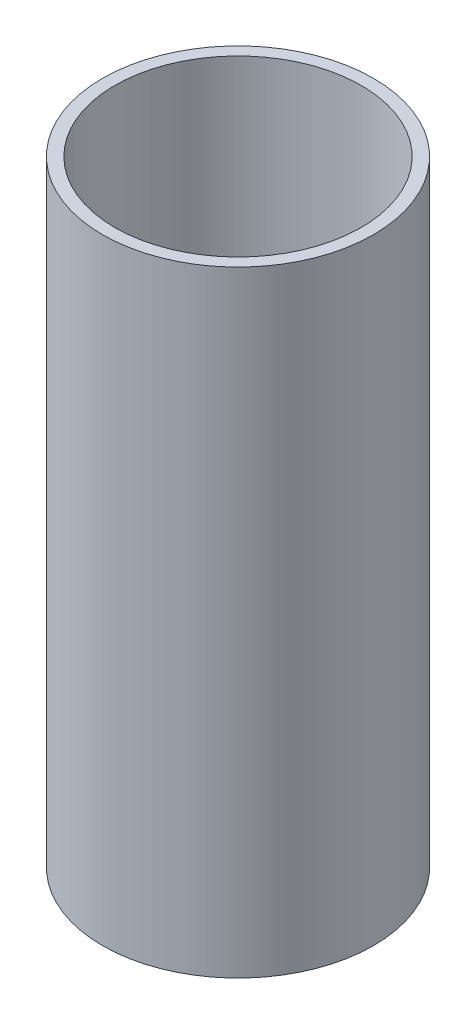
ISO-10303-21;
HEADER;
FILE_DESCRIPTION(('STEP AP214'),'2;1');
FILE_NAME('part.step','',(''),(''),'','','');
FILE_SCHEMA(('AUTOMOTIVE_DESIGN { 1 0 10303 214 1 1 1 1 }'));
ENDSEC;
DATA;
#1=APPLICATION_CONTEXT('core data for automotive mechanical design processes');
#2=APPLICATION_PROTOCOL_DEFINITION('international standard','automotive_design',2000,#1);
#3=PRODUCT_CONTEXT('',#1,'mechanical');
#4=PRODUCT('Part','Part','',(#3));
#5=PRODUCT_RELATED_PRODUCT_CATEGORY('part','',(#4));
#6=PRODUCT_DEFINITION_FORMATION('','',#4);
#7=PRODUCT_DEFINITION_CONTEXT('part definition',#1,'design');
#8=PRODUCT_DEFINITION('design','',#6,#7);
#9=PRODUCT_DEFINITION_SHAPE('','',#8);
#10=(LENGTH_UNIT() NAMED_UNIT(*) SI_UNIT(.MILLI.,.METRE.));
#11=(NAMED_UNIT(*) PLANE_ANGLE_UNIT() SI_UNIT($,.RADIAN.));
#12=(NAMED_UNIT(*) SI_UNIT($,.STERADIAN.) SOLID_ANGLE_UNIT());
#13=UNCERTAINTY_MEASURE_WITH_UNIT(LENGTH_MEASURE(1.E-05),#10,'distance_accuracy_value','');
#14=(GEOMETRIC_REPRESENTATION_CONTEXT(3) GLOBAL_UNCERTAINTY_ASSIGNED_CONTEXT((#13)) GLOBAL_UNIT_ASSIGNED_CONTEXT((#10,
#11,#12)) REPRESENTATION_CONTEXT('',''));
#15=CARTESIAN_POINT('',(0.,0.,0.));
#16=DIRECTION('',(0.,0.,1.));
#17=DIRECTION('',(1.,0.,0.));
#18=AXIS2_PLACEMENT_3D('',#15,#16,#17);
#19=CARTESIAN_POINT('',(0.,250.,0.));
#20=DIRECTION('',(0.,1.,0.));
#21=DIRECTION('',(0.,0.,1.));
#22=AXIS2_PLACEMENT_3D('',#19,#20,#21);
#23=PLANE('',#22);
#24=CARTESIAN_POINT('',(0.,250.,0.));
#25=DIRECTION('',(0.,1.,0.));
#26=DIRECTION('',(0.,0.,1.));
#27=AXIS2_PLACEMENT_3D('',#24,#25,#26);
#28=CIRCLE('',#27,55.);
#29=CARTESIAN_POINT('',(0.,250.,55.));
#30=VERTEX_POINT('',#29);
#31=EDGE_CURVE('E10',#30,#30,#28,.T.);
#32=ORIENTED_EDGE('',*,*,#31,.T.);
#33=EDGE_LOOP('',(#32));
#34=FACE_BOUND('',#33,.T.);
#35=CARTESIAN_POINT('',(0.,250.,0.));
#36=DIRECTION('',(0.,1.,0.));
#37=DIRECTION('',(0.,0.,1.));
#38=AXIS2_PLACEMENT_3D('',#35,#36,#37);
#39=CIRCLE('',#38,50.);
#40=CARTESIAN_POINT('',(0.,250.,50.));
#41=VERTEX_POINT('',#40);
#42=EDGE_CURVE('E57',#41,#41,#39,.T.);
#43=ORIENTED_EDGE('',*,*,#42,.F.);
#44=EDGE_LOOP('',(#43));
#45=FACE_BOUND('',#44,.T.);
#46=ADVANCED_FACE('F44',(#34,#45),#23,.T.);
#47=CARTESIAN_POINT('',(0.,0.,0.));
#48=DIRECTION('',(0.,1.,0.));
#49=DIRECTION('',(0.,0.,1.));
#50=AXIS2_PLACEMENT_3D('',#47,#48,#49);
#51=PLANE('',#50);
#52=CARTESIAN_POINT('',(0.,0.,0.));
#53=DIRECTION('',(0.,1.,0.));
#54=DIRECTION('',(0.,0.,1.));
#55=AXIS2_PLACEMENT_3D('',#52,#53,#54);
#56=CIRCLE('',#55,55.);
#57=CARTESIAN_POINT('',(0.,0.,55.));
#58=VERTEX_POINT('',#57);
#59=EDGE_CURVE('E48',#58,#58,#56,.T.);
#60=ORIENTED_EDGE('',*,*,#59,.F.);
#61=EDGE_LOOP('',(#60));
#62=FACE_BOUND('',#61,.T.);
#63=CARTESIAN_POINT('',(0.,0.,0.));
#64=DIRECTION('',(0.,1.,0.));
#65=DIRECTION('',(0.,0.,1.));
#66=AXIS2_PLACEMENT_3D('',#63,#64,#65);
#67=CIRCLE('',#66,50.);
#68=CARTESIAN_POINT('',(0.,0.,50.));
#69=VERTEX_POINT('',#68);
#70=EDGE_CURVE('E59',#69,#69,#67,.T.);
#71=ORIENTED_EDGE('',*,*,#70,.T.);
#72=EDGE_LOOP('',(#71));
#73=FACE_BOUND('',#72,.T.);
#74=ADVANCED_FACE('F71',(#62,#73),#51,.F.);
#75=CARTESIAN_POINT('',(0.,250.,0.));
#76=DIRECTION('',(0.,-1.,0.));
#77=DIRECTION('',(0.,0.,-1.));
#78=AXIS2_PLACEMENT_3D('',#75,#76,#77);
#79=CYLINDRICAL_SURFACE('',#78,55.);
#80=ORIENTED_EDGE('',*,*,#31,.F.);
#81=EDGE_LOOP('',(#80));
#82=FACE_BOUND('',#81,.T.);
#83=ORIENTED_EDGE('',*,*,#59,.T.);
#84=EDGE_LOOP('',(#83));
#85=FACE_BOUND('',#84,.T.);
#86=ADVANCED_FACE('F46',(#82,#85),#79,.T.);
#87=CARTESIAN_POINT('',(0.,250.,0.));
#88=DIRECTION('',(0.,-1.,0.));
#89=DIRECTION('',(0.,0.,-1.));
#90=AXIS2_PLACEMENT_3D('',#87,#88,#89);
#91=CYLINDRICAL_SURFACE('',#90,50.);
#92=ORIENTED_EDGE('',*,*,#42,.T.);
#93=EDGE_LOOP('',(#92));
#94=FACE_BOUND('',#93,.T.);
#95=ORIENTED_EDGE('',*,*,#70,.F.);
#96=EDGE_LOOP('',(#95));
#97=FACE_BOUND('',#96,.T.);
#98=ADVANCED_FACE('F67',(#94,#97),#91,.F.);
#99=CLOSED_SHELL('',(#46,#74,#86,#98));
#100=MANIFOLD_SOLID_BREP('B2',#99);
#101=ADVANCED_BREP_SHAPE_REPRESENTATION('',(#18,#100),#14);
#102=SHAPE_DEFINITION_REPRESENTATION(#9,#101);
ENDSEC;
END-ISO-10303-21;
